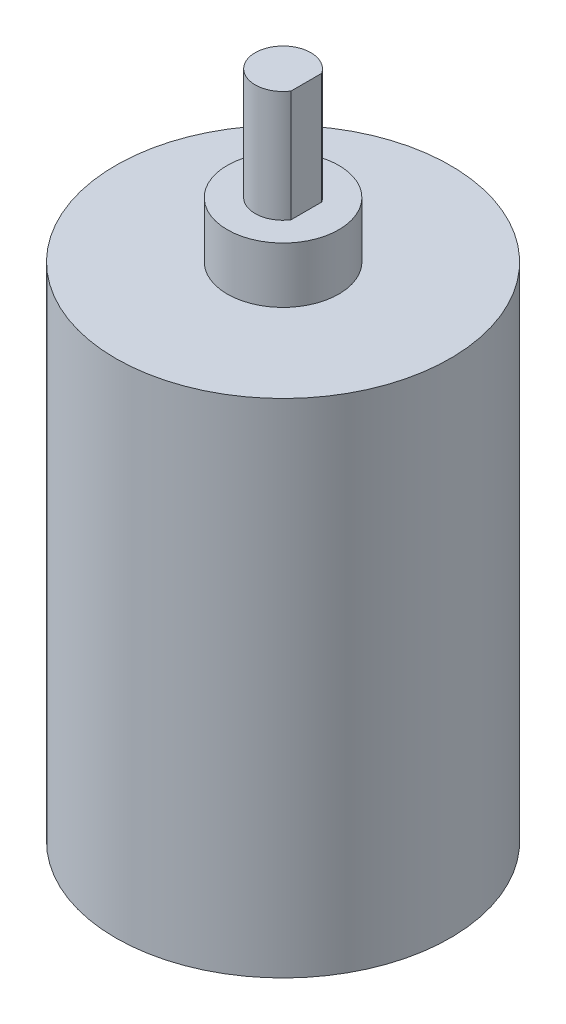
ISO-10303-21;
HEADER;
FILE_DESCRIPTION(('STEP AP214'),'2;1');
FILE_NAME('part.step','',(''),(''),'','','');
FILE_SCHEMA(('AUTOMOTIVE_DESIGN { 1 0 10303 214 1 1 1 1 }'));
ENDSEC;
DATA;
#1=APPLICATION_CONTEXT('core data for automotive mechanical design processes');
#2=APPLICATION_PROTOCOL_DEFINITION('international standard','automotive_design',2000,#1);
#3=PRODUCT_CONTEXT('',#1,'mechanical');
#4=PRODUCT('Part','Part','',(#3));
#5=PRODUCT_RELATED_PRODUCT_CATEGORY('part','',(#4));
#6=PRODUCT_DEFINITION_FORMATION('','',#4);
#7=PRODUCT_DEFINITION_CONTEXT('part definition',#1,'design');
#8=PRODUCT_DEFINITION('design','',#6,#7);
#9=PRODUCT_DEFINITION_SHAPE('','',#8);
#10=(LENGTH_UNIT() NAMED_UNIT(*) SI_UNIT(.MILLI.,.METRE.));
#11=(NAMED_UNIT(*) PLANE_ANGLE_UNIT() SI_UNIT($,.RADIAN.));
#12=(NAMED_UNIT(*) SI_UNIT($,.STERADIAN.) SOLID_ANGLE_UNIT());
#13=UNCERTAINTY_MEASURE_WITH_UNIT(LENGTH_MEASURE(1.E-05),#10,'distance_accuracy_value','');
#14=(GEOMETRIC_REPRESENTATION_CONTEXT(3) GLOBAL_UNCERTAINTY_ASSIGNED_CONTEXT((#13)) GLOBAL_UNIT_ASSIGNED_CONTEXT((#10,
#11,#12)) REPRESENTATION_CONTEXT('',''));
#15=CARTESIAN_POINT('',(0.,0.,0.));
#16=DIRECTION('',(0.,0.,1.));
#17=DIRECTION('',(1.,0.,0.));
#18=AXIS2_PLACEMENT_3D('',#15,#16,#17);
#19=CARTESIAN_POINT('',(0.,57.15,0.));
#20=DIRECTION('',(0.,-1.,0.));
#21=DIRECTION('',(0.,0.,-1.));
#22=AXIS2_PLACEMENT_3D('',#19,#20,#21);
#23=CYLINDRICAL_SURFACE('',#22,19.05);
#24=CARTESIAN_POINT('',(0.,57.15,0.));
#25=DIRECTION('',(0.,1.,0.));
#26=DIRECTION('',(0.,0.,1.));
#27=AXIS2_PLACEMENT_3D('',#24,#25,#26);
#28=CIRCLE('',#27,19.05);
#29=CARTESIAN_POINT('',(0.,57.15,19.05));
#30=VERTEX_POINT('',#29);
#31=EDGE_CURVE('E81',#30,#30,#28,.T.);
#32=ORIENTED_EDGE('',*,*,#31,.F.);
#33=EDGE_LOOP('',(#32));
#34=FACE_BOUND('',#33,.T.);
#35=CARTESIAN_POINT('',(0.,0.,0.));
#36=DIRECTION('',(0.,1.,0.));
#37=DIRECTION('',(0.,0.,1.));
#38=AXIS2_PLACEMENT_3D('',#35,#36,#37);
#39=CIRCLE('',#38,19.05);
#40=CARTESIAN_POINT('',(0.,0.,19.05));
#41=VERTEX_POINT('',#40);
#42=EDGE_CURVE('E37',#41,#41,#39,.T.);
#43=ORIENTED_EDGE('',*,*,#42,.T.);
#44=EDGE_LOOP('',(#43));
#45=FACE_BOUND('',#44,.T.);
#46=ADVANCED_FACE('F34',(#34,#45),#23,.T.);
#47=CARTESIAN_POINT('',(0.,57.15,0.));
#48=DIRECTION('',(0.,1.,0.));
#49=DIRECTION('',(0.,0.,1.));
#50=AXIS2_PLACEMENT_3D('',#47,#48,#49);
#51=PLANE('',#50);
#52=CARTESIAN_POINT('',(0.,57.15,0.));
#53=DIRECTION('',(0.,1.,0.));
#54=DIRECTION('',(0.,0.,1.));
#55=AXIS2_PLACEMENT_3D('',#52,#53,#54);
#56=CIRCLE('',#55,6.35);
#57=CARTESIAN_POINT('',(0.,57.15,6.35));
#58=VERTEX_POINT('',#57);
#59=EDGE_CURVE('E42',#58,#58,#56,.T.);
#60=ORIENTED_EDGE('',*,*,#59,.F.);
#61=EDGE_LOOP('',(#60));
#62=FACE_BOUND('',#61,.T.);
#63=ORIENTED_EDGE('',*,*,#31,.T.);
#64=EDGE_LOOP('',(#63));
#65=FACE_BOUND('',#64,.T.);
#66=ADVANCED_FACE('F92',(#62,#65),#51,.T.);
#67=CARTESIAN_POINT('',(0.,0.,0.));
#68=DIRECTION('',(0.,1.,0.));
#69=DIRECTION('',(0.,0.,1.));
#70=AXIS2_PLACEMENT_3D('',#67,#68,#69);
#71=PLANE('',#70);
#72=ORIENTED_EDGE('',*,*,#42,.F.);
#73=EDGE_LOOP('',(#72));
#74=FACE_BOUND('',#73,.T.);
#75=ADVANCED_FACE('F89',(#74),#71,.F.);
#76=CARTESIAN_POINT('',(0.,63.5,0.));
#77=DIRECTION('',(0.,-1.,0.));
#78=DIRECTION('',(0.,0.,-1.));
#79=AXIS2_PLACEMENT_3D('',#76,#77,#78);
#80=CYLINDRICAL_SURFACE('',#79,6.35);
#81=CARTESIAN_POINT('',(0.,63.5,0.));
#82=DIRECTION('',(0.,1.,0.));
#83=DIRECTION('',(0.,0.,1.));
#84=AXIS2_PLACEMENT_3D('',#81,#82,#83);
#85=CIRCLE('',#84,6.35);
#86=CARTESIAN_POINT('',(0.,63.5,6.35));
#87=VERTEX_POINT('',#86);
#88=EDGE_CURVE('E73',#87,#87,#85,.T.);
#89=ORIENTED_EDGE('',*,*,#88,.F.);
#90=EDGE_LOOP('',(#89));
#91=FACE_BOUND('',#90,.T.);
#92=ORIENTED_EDGE('',*,*,#59,.T.);
#93=EDGE_LOOP('',(#92));
#94=FACE_BOUND('',#93,.T.);
#95=ADVANCED_FACE('F91',(#91,#94),#80,.T.);
#96=CARTESIAN_POINT('',(0.,63.5,0.));
#97=DIRECTION('',(0.,1.,0.));
#98=DIRECTION('',(0.,0.,1.));
#99=AXIS2_PLACEMENT_3D('',#96,#97,#98);
#100=PLANE('',#99);
#101=CARTESIAN_POINT('',(0.,63.5,0.));
#102=DIRECTION('',(0.,1.,0.));
#103=DIRECTION('',(0.,0.,1.));
#104=AXIS2_PLACEMENT_3D('',#101,#102,#103);
#105=CIRCLE('',#104,3.175);
#106=CARTESIAN_POINT('',(2.64875531929962,63.5,-1.75063424463307));
#107=VERTEX_POINT('',#106);
#108=CARTESIAN_POINT('',(2.64875531929962,63.5,1.75063424463307));
#109=VERTEX_POINT('',#108);
#110=EDGE_CURVE('E11',#107,#109,#105,.T.);
#111=ORIENTED_EDGE('',*,*,#110,.F.);
#112=DIRECTION('',(0.,0.,-1.));
#113=VECTOR('',#112,1.);
#114=CARTESIAN_POINT('',(2.64875531929962,63.5,-1.75063424463307));
#115=LINE('',#114,#113);
#116=EDGE_CURVE('E55',#109,#107,#115,.T.);
#117=ORIENTED_EDGE('',*,*,#116,.F.);
#118=EDGE_LOOP('',(#111,#117));
#119=FACE_BOUND('',#118,.T.);
#120=ORIENTED_EDGE('',*,*,#88,.T.);
#121=EDGE_LOOP('',(#120));
#122=FACE_BOUND('',#121,.T.);
#123=ADVANCED_FACE('F97',(#119,#122),#100,.T.);
#124=CARTESIAN_POINT('',(0.,76.2,0.));
#125=DIRECTION('',(0.,-1.,0.));
#126=DIRECTION('',(0.,0.,-1.));
#127=AXIS2_PLACEMENT_3D('',#124,#125,#126);
#128=CYLINDRICAL_SURFACE('',#127,3.175);
#129=CARTESIAN_POINT('',(0.,76.2,0.));
#130=DIRECTION('',(0.,1.,0.));
#131=DIRECTION('',(0.,0.,1.));
#132=AXIS2_PLACEMENT_3D('',#129,#130,#131);
#133=CIRCLE('',#132,3.175);
#134=CARTESIAN_POINT('',(2.64875531929962,76.2,-1.75063424463307));
#135=VERTEX_POINT('',#134);
#136=CARTESIAN_POINT('',(2.64875531929962,76.2,1.75063424463307));
#137=VERTEX_POINT('',#136);
#138=EDGE_CURVE('E69',#135,#137,#133,.T.);
#139=ORIENTED_EDGE('',*,*,#138,.F.);
#140=DIRECTION('',(0.,1.,0.));
#141=VECTOR('',#140,1.);
#142=CARTESIAN_POINT('',(2.64875531929962,59.9594047819761,-1.75063424463307));
#143=LINE('',#142,#141);
#144=EDGE_CURVE('E50',#107,#135,#143,.T.);
#145=ORIENTED_EDGE('',*,*,#144,.F.);
#146=ORIENTED_EDGE('',*,*,#110,.T.);
#147=DIRECTION('',(0.,1.,0.));
#148=VECTOR('',#147,1.);
#149=CARTESIAN_POINT('',(2.64875531929962,59.9594047819761,1.75063424463307));
#150=LINE('',#149,#148);
#151=EDGE_CURVE('E62',#109,#137,#150,.T.);
#152=ORIENTED_EDGE('',*,*,#151,.T.);
#153=EDGE_LOOP('',(#139,#145,#146,#152));
#154=FACE_BOUND('',#153,.T.);
#155=ADVANCED_FACE('F68',(#154),#128,.T.);
#156=CARTESIAN_POINT('',(0.,76.2,0.));
#157=DIRECTION('',(0.,1.,0.));
#158=DIRECTION('',(0.,0.,1.));
#159=AXIS2_PLACEMENT_3D('',#156,#157,#158);
#160=PLANE('',#159);
#161=DIRECTION('',(0.,0.,1.));
#162=VECTOR('',#161,1.);
#163=CARTESIAN_POINT('',(2.64875531929962,76.2,-1.75063424463307));
#164=LINE('',#163,#162);
#165=EDGE_CURVE('E59',#135,#137,#164,.T.);
#166=ORIENTED_EDGE('',*,*,#165,.F.);
#167=ORIENTED_EDGE('',*,*,#138,.T.);
#168=EDGE_LOOP('',(#166,#167));
#169=FACE_BOUND('',#168,.T.);
#170=ADVANCED_FACE('F72',(#169),#160,.T.);
#171=CARTESIAN_POINT('',(2.64875531929962,59.9594047819761,-1.75063424463307));
#172=DIRECTION('',(-1.,0.,0.));
#173=DIRECTION('',(0.,0.,1.));
#174=AXIS2_PLACEMENT_3D('',#171,#172,#173);
#175=PLANE('',#174);
#176=ORIENTED_EDGE('',*,*,#116,.T.);
#177=ORIENTED_EDGE('',*,*,#144,.T.);
#178=ORIENTED_EDGE('',*,*,#165,.T.);
#179=ORIENTED_EDGE('',*,*,#151,.F.);
#180=EDGE_LOOP('',(#176,#177,#178,#179));
#181=FACE_BOUND('',#180,.T.);
#182=ADVANCED_FACE('F61',(#181),#175,.F.);
#183=CLOSED_SHELL('',(#46,#66,#75,#95,#123,#155,#170,#182));
#184=MANIFOLD_SOLID_BREP('B2',#183);
#185=ADVANCED_BREP_SHAPE_REPRESENTATION('',(#18,#184),#14);
#186=SHAPE_DEFINITION_REPRESENTATION(#9,#185);
ENDSEC;
END-ISO-10303-21;
